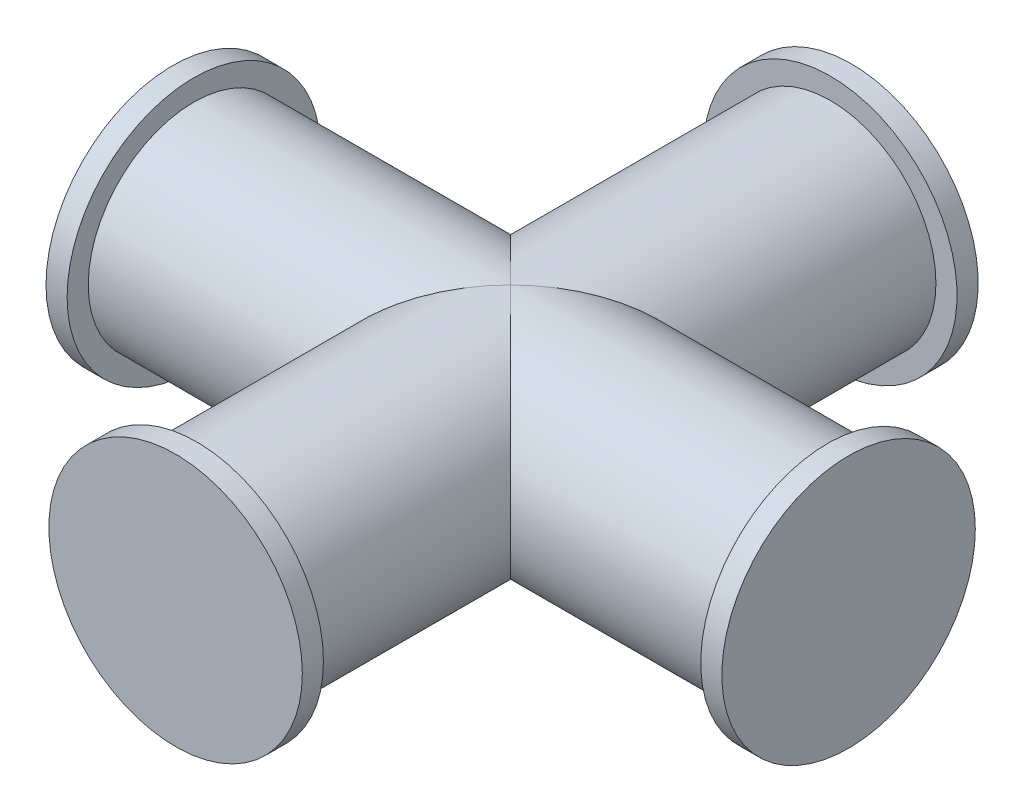
ISO-10303-21;
HEADER;
FILE_DESCRIPTION(('STEP AP214'),'2;1');
FILE_NAME('part.step','',(''),(''),'','','');
FILE_SCHEMA(('AUTOMOTIVE_DESIGN { 1 0 10303 214 1 1 1 1 }'));
ENDSEC;
DATA;
#1=APPLICATION_CONTEXT('core data for automotive mechanical design processes');
#2=APPLICATION_PROTOCOL_DEFINITION('international standard','automotive_design',2000,#1);
#3=PRODUCT_CONTEXT('',#1,'mechanical');
#4=PRODUCT('Part','Part','',(#3));
#5=PRODUCT_RELATED_PRODUCT_CATEGORY('part','',(#4));
#6=PRODUCT_DEFINITION_FORMATION('','',#4);
#7=PRODUCT_DEFINITION_CONTEXT('part definition',#1,'design');
#8=PRODUCT_DEFINITION('design','',#6,#7);
#9=PRODUCT_DEFINITION_SHAPE('','',#8);
#10=(LENGTH_UNIT() NAMED_UNIT(*) SI_UNIT(.MILLI.,.METRE.));
#11=(NAMED_UNIT(*) PLANE_ANGLE_UNIT() SI_UNIT($,.RADIAN.));
#12=(NAMED_UNIT(*) SI_UNIT($,.STERADIAN.) SOLID_ANGLE_UNIT());
#13=UNCERTAINTY_MEASURE_WITH_UNIT(LENGTH_MEASURE(1.E-05),#10,'distance_accuracy_value','');
#14=(GEOMETRIC_REPRESENTATION_CONTEXT(3) GLOBAL_UNCERTAINTY_ASSIGNED_CONTEXT((#13)) GLOBAL_UNIT_ASSIGNED_CONTEXT((#10,
#11,#12)) REPRESENTATION_CONTEXT('',''));
#15=CARTESIAN_POINT('',(0.,0.,0.));
#16=DIRECTION('',(0.,0.,1.));
#17=DIRECTION('',(1.,0.,0.));
#18=AXIS2_PLACEMENT_3D('',#15,#16,#17);
#19=CARTESIAN_POINT('',(0.,0.,60.));
#20=DIRECTION('',(0.,0.,-1.));
#21=DIRECTION('',(-1.,0.,0.));
#22=AXIS2_PLACEMENT_3D('',#19,#20,#21);
#23=CYLINDRICAL_SURFACE('',#22,10.);
#24=CARTESIAN_POINT('',(0.,0.,60.));
#25=DIRECTION('',(0.,0.,1.));
#26=DIRECTION('',(1.,0.,0.));
#27=AXIS2_PLACEMENT_3D('',#24,#25,#26);
#28=CIRCLE('',#27,10.);
#29=CARTESIAN_POINT('',(10.,0.,60.));
#30=VERTEX_POINT('',#29);
#31=EDGE_CURVE('E60',#30,#30,#28,.T.);
#32=ORIENTED_EDGE('',*,*,#31,.F.);
#33=EDGE_LOOP('',(#32));
#34=FACE_BOUND('',#33,.T.);
#35=CARTESIAN_POINT('',(0.,0.,30.27140407));
#36=DIRECTION('',(-0.707106781186547,0.,-0.707106781186547));
#37=DIRECTION('',(0.707106781186547,0.,-0.707106781186547));
#38=AXIS2_PLACEMENT_3D('',#35,#36,#37);
#39=ELLIPSE('',#38,14.1421356237309,10.);
#40=CARTESIAN_POINT('',(0.,-10.,30.27140407));
#41=VERTEX_POINT('',#40);
#42=CARTESIAN_POINT('',(0.,10.,30.27140407));
#43=VERTEX_POINT('',#42);
#44=EDGE_CURVE('E44',#41,#43,#39,.T.);
#45=ORIENTED_EDGE('',*,*,#44,.F.);
#46=CARTESIAN_POINT('',(0.,0.,30.27140407));
#47=DIRECTION('',(0.707106781186547,0.,-0.707106781186547));
#48=DIRECTION('',(-0.707106781186547,0.,-0.707106781186547));
#49=AXIS2_PLACEMENT_3D('',#46,#47,#48);
#50=ELLIPSE('',#49,14.1421356237309,10.);
#51=EDGE_CURVE('E56',#43,#41,#50,.T.);
#52=ORIENTED_EDGE('',*,*,#51,.F.);
#53=EDGE_LOOP('',(#45,#52));
#54=FACE_BOUND('',#53,.T.);
#55=ADVANCED_FACE('F36',(#34,#54),#23,.T.);
#56=CARTESIAN_POINT('',(0.,0.,60.));
#57=DIRECTION('',(0.,0.,1.));
#58=DIRECTION('',(1.,0.,0.));
#59=AXIS2_PLACEMENT_3D('',#56,#57,#58);
#60=PLANE('',#59);
#61=CARTESIAN_POINT('',(0.,0.,60.));
#62=DIRECTION('',(0.,0.,1.));
#63=DIRECTION('',(1.,0.,0.));
#64=AXIS2_PLACEMENT_3D('',#61,#62,#63);
#65=CIRCLE('',#64,12.);
#66=CARTESIAN_POINT('',(12.,0.,60.));
#67=VERTEX_POINT('',#66);
#68=EDGE_CURVE('E99',#67,#67,#65,.T.);
#69=ORIENTED_EDGE('',*,*,#68,.F.);
#70=EDGE_LOOP('',(#69));
#71=FACE_BOUND('',#70,.T.);
#72=ORIENTED_EDGE('',*,*,#31,.T.);
#73=EDGE_LOOP('',(#72));
#74=FACE_BOUND('',#73,.T.);
#75=ADVANCED_FACE('F85',(#71,#74),#60,.F.);
#76=CARTESIAN_POINT('',(0.,0.,62.));
#77=DIRECTION('',(0.,0.,-1.));
#78=DIRECTION('',(-1.,0.,0.));
#79=AXIS2_PLACEMENT_3D('',#76,#77,#78);
#80=CYLINDRICAL_SURFACE('',#79,12.);
#81=CARTESIAN_POINT('',(0.,0.,62.));
#82=DIRECTION('',(0.,0.,1.));
#83=DIRECTION('',(1.,0.,0.));
#84=AXIS2_PLACEMENT_3D('',#81,#82,#83);
#85=CIRCLE('',#84,12.);
#86=CARTESIAN_POINT('',(12.,0.,62.));
#87=VERTEX_POINT('',#86);
#88=EDGE_CURVE('E96',#87,#87,#85,.T.);
#89=ORIENTED_EDGE('',*,*,#88,.F.);
#90=EDGE_LOOP('',(#89));
#91=FACE_BOUND('',#90,.T.);
#92=ORIENTED_EDGE('',*,*,#68,.T.);
#93=EDGE_LOOP('',(#92));
#94=FACE_BOUND('',#93,.T.);
#95=ADVANCED_FACE('F90',(#91,#94),#80,.T.);
#96=CARTESIAN_POINT('',(0.,0.,62.));
#97=DIRECTION('',(0.,0.,1.));
#98=DIRECTION('',(1.,0.,0.));
#99=AXIS2_PLACEMENT_3D('',#96,#97,#98);
#100=PLANE('',#99);
#101=ORIENTED_EDGE('',*,*,#88,.T.);
#102=EDGE_LOOP('',(#101));
#103=FACE_BOUND('',#102,.T.);
#104=ADVANCED_FACE('F82',(#103),#100,.T.);
#105=CARTESIAN_POINT('',(30.,0.,30.27140407));
#106=DIRECTION('',(-1.,0.,0.));
#107=DIRECTION('',(0.,0.,1.));
#108=AXIS2_PLACEMENT_3D('',#105,#106,#107);
#109=CYLINDRICAL_SURFACE('',#108,10.);
#110=CARTESIAN_POINT('',(-30.,0.,30.27140407));
#111=DIRECTION('',(-1.,0.,0.));
#112=DIRECTION('',(0.,0.,1.));
#113=AXIS2_PLACEMENT_3D('',#110,#111,#112);
#114=CIRCLE('',#113,10.);
#115=CARTESIAN_POINT('',(-30.,0.,40.27140407));
#116=VERTEX_POINT('',#115);
#117=EDGE_CURVE('E120',#116,#116,#114,.T.);
#118=ORIENTED_EDGE('',*,*,#117,.F.);
#119=EDGE_LOOP('',(#118));
#120=FACE_BOUND('',#119,.T.);
#121=CARTESIAN_POINT('',(0.,0.,30.27140407));
#122=DIRECTION('',(0.707106781186547,0.,-0.707106781186547));
#123=DIRECTION('',(-0.707106781186547,0.,-0.707106781186547));
#124=AXIS2_PLACEMENT_3D('',#121,#122,#123);
#125=ELLIPSE('',#124,14.1421356237309,10.);
#126=EDGE_CURVE('E50',#43,#41,#125,.F.);
#127=ORIENTED_EDGE('',*,*,#126,.T.);
#128=ORIENTED_EDGE('',*,*,#44,.T.);
#129=EDGE_LOOP('',(#127,#128));
#130=FACE_BOUND('',#129,.T.);
#131=ADVANCED_FACE('F62',(#120,#130),#109,.T.);
#132=CARTESIAN_POINT('',(0.,0.,-2.));
#133=DIRECTION('',(0.,0.,-1.));
#134=DIRECTION('',(-1.,0.,0.));
#135=AXIS2_PLACEMENT_3D('',#132,#133,#134);
#136=PLANE('',#135);
#137=CARTESIAN_POINT('',(0.,0.,-2.));
#138=DIRECTION('',(0.,0.,-1.));
#139=DIRECTION('',(-1.,0.,0.));
#140=AXIS2_PLACEMENT_3D('',#137,#138,#139);
#141=CIRCLE('',#140,12.);
#142=CARTESIAN_POINT('',(-12.,0.,-2.));
#143=VERTEX_POINT('',#142);
#144=EDGE_CURVE('E107',#143,#143,#141,.T.);
#145=ORIENTED_EDGE('',*,*,#144,.T.);
#146=EDGE_LOOP('',(#145));
#147=FACE_BOUND('',#146,.T.);
#148=ADVANCED_FACE('F81',(#147),#136,.T.);
#149=CARTESIAN_POINT('',(0.,0.,-2.));
#150=DIRECTION('',(0.,0.,1.));
#151=DIRECTION('',(1.,0.,0.));
#152=AXIS2_PLACEMENT_3D('',#149,#150,#151);
#153=CYLINDRICAL_SURFACE('',#152,12.);
#154=ORIENTED_EDGE('',*,*,#144,.F.);
#155=EDGE_LOOP('',(#154));
#156=FACE_BOUND('',#155,.T.);
#157=CARTESIAN_POINT('',(0.,0.,0.));
#158=DIRECTION('',(0.,0.,-1.));
#159=DIRECTION('',(-1.,0.,0.));
#160=AXIS2_PLACEMENT_3D('',#157,#158,#159);
#161=CIRCLE('',#160,12.);
#162=CARTESIAN_POINT('',(-12.,0.,0.));
#163=VERTEX_POINT('',#162);
#164=EDGE_CURVE('E108',#163,#163,#161,.T.);
#165=ORIENTED_EDGE('',*,*,#164,.T.);
#166=EDGE_LOOP('',(#165));
#167=FACE_BOUND('',#166,.T.);
#168=ADVANCED_FACE('F217',(#156,#167),#153,.T.);
#169=CARTESIAN_POINT('',(0.,0.,0.));
#170=DIRECTION('',(0.,0.,-1.));
#171=DIRECTION('',(-1.,0.,0.));
#172=AXIS2_PLACEMENT_3D('',#169,#170,#171);
#173=PLANE('',#172);
#174=ORIENTED_EDGE('',*,*,#164,.F.);
#175=EDGE_LOOP('',(#174));
#176=FACE_BOUND('',#175,.T.);
#177=CARTESIAN_POINT('',(0.,0.,0.));
#178=DIRECTION('',(0.,0.,-1.));
#179=DIRECTION('',(-1.,0.,0.));
#180=AXIS2_PLACEMENT_3D('',#177,#178,#179);
#181=CIRCLE('',#180,10.);
#182=CARTESIAN_POINT('',(-10.,0.,0.));
#183=VERTEX_POINT('',#182);
#184=EDGE_CURVE('E103',#183,#183,#181,.T.);
#185=ORIENTED_EDGE('',*,*,#184,.T.);
#186=EDGE_LOOP('',(#185));
#187=FACE_BOUND('',#186,.T.);
#188=ADVANCED_FACE('F75',(#176,#187),#173,.F.);
#189=ORIENTED_EDGE('',*,*,#184,.F.);
#190=EDGE_LOOP('',(#189));
#191=FACE_BOUND('',#190,.T.);
#192=CARTESIAN_POINT('',(0.,0.,30.27140407));
#193=DIRECTION('',(-0.707106781186547,0.,-0.707106781186547));
#194=DIRECTION('',(0.707106781186547,0.,-0.707106781186547));
#195=AXIS2_PLACEMENT_3D('',#192,#193,#194);
#196=ELLIPSE('',#195,14.1421356237309,10.);
#197=EDGE_CURVE('E11',#41,#43,#196,.F.);
#198=ORIENTED_EDGE('',*,*,#197,.F.);
#199=ORIENTED_EDGE('',*,*,#126,.F.);
#200=EDGE_LOOP('',(#198,#199));
#201=FACE_BOUND('',#200,.T.);
#202=ADVANCED_FACE('F38',(#191,#201),#23,.T.);
#203=CARTESIAN_POINT('',(30.,0.,30.27140407));
#204=DIRECTION('',(1.,0.,0.));
#205=DIRECTION('',(0.,0.,-1.));
#206=AXIS2_PLACEMENT_3D('',#203,#204,#205);
#207=CIRCLE('',#206,10.);
#208=CARTESIAN_POINT('',(30.,0.,20.27140407));
#209=VERTEX_POINT('',#208);
#210=EDGE_CURVE('E111',#209,#209,#207,.T.);
#211=ORIENTED_EDGE('',*,*,#210,.F.);
#212=EDGE_LOOP('',(#211));
#213=FACE_BOUND('',#212,.T.);
#214=ORIENTED_EDGE('',*,*,#51,.T.);
#215=ORIENTED_EDGE('',*,*,#197,.T.);
#216=EDGE_LOOP('',(#214,#215));
#217=FACE_BOUND('',#216,.T.);
#218=ADVANCED_FACE('F63',(#213,#217),#109,.T.);
#219=CARTESIAN_POINT('',(30.,0.,30.27140407));
#220=DIRECTION('',(1.,0.,0.));
#221=DIRECTION('',(0.,0.,-1.));
#222=AXIS2_PLACEMENT_3D('',#219,#220,#221);
#223=PLANE('',#222);
#224=CARTESIAN_POINT('',(30.,0.,30.27140407));
#225=DIRECTION('',(1.,0.,0.));
#226=DIRECTION('',(0.,0.,-1.));
#227=AXIS2_PLACEMENT_3D('',#224,#225,#226);
#228=CIRCLE('',#227,12.);
#229=CARTESIAN_POINT('',(30.,0.,18.27140407));
#230=VERTEX_POINT('',#229);
#231=EDGE_CURVE('E117',#230,#230,#228,.T.);
#232=ORIENTED_EDGE('',*,*,#231,.F.);
#233=EDGE_LOOP('',(#232));
#234=FACE_BOUND('',#233,.T.);
#235=ORIENTED_EDGE('',*,*,#210,.T.);
#236=EDGE_LOOP('',(#235));
#237=FACE_BOUND('',#236,.T.);
#238=ADVANCED_FACE('F65',(#234,#237),#223,.F.);
#239=CARTESIAN_POINT('',(32.,0.,30.27140407));
#240=DIRECTION('',(-1.,0.,0.));
#241=DIRECTION('',(0.,0.,1.));
#242=AXIS2_PLACEMENT_3D('',#239,#240,#241);
#243=CYLINDRICAL_SURFACE('',#242,12.);
#244=CARTESIAN_POINT('',(32.,0.,30.27140407));
#245=DIRECTION('',(1.,0.,0.));
#246=DIRECTION('',(0.,0.,-1.));
#247=AXIS2_PLACEMENT_3D('',#244,#245,#246);
#248=CIRCLE('',#247,12.);
#249=CARTESIAN_POINT('',(32.,0.,18.27140407));
#250=VERTEX_POINT('',#249);
#251=EDGE_CURVE('E116',#250,#250,#248,.T.);
#252=ORIENTED_EDGE('',*,*,#251,.F.);
#253=EDGE_LOOP('',(#252));
#254=FACE_BOUND('',#253,.T.);
#255=ORIENTED_EDGE('',*,*,#231,.T.);
#256=EDGE_LOOP('',(#255));
#257=FACE_BOUND('',#256,.T.);
#258=ADVANCED_FACE('F72',(#254,#257),#243,.T.);
#259=CARTESIAN_POINT('',(32.,0.,30.27140407));
#260=DIRECTION('',(1.,0.,0.));
#261=DIRECTION('',(0.,0.,-1.));
#262=AXIS2_PLACEMENT_3D('',#259,#260,#261);
#263=PLANE('',#262);
#264=ORIENTED_EDGE('',*,*,#251,.T.);
#265=EDGE_LOOP('',(#264));
#266=FACE_BOUND('',#265,.T.);
#267=ADVANCED_FACE('F143',(#266),#263,.T.);
#268=CARTESIAN_POINT('',(-30.,0.,30.27140407));
#269=DIRECTION('',(-1.,0.,0.));
#270=DIRECTION('',(0.,0.,1.));
#271=AXIS2_PLACEMENT_3D('',#268,#269,#270);
#272=PLANE('',#271);
#273=CARTESIAN_POINT('',(-30.,0.,30.27140407));
#274=DIRECTION('',(-1.,0.,0.));
#275=DIRECTION('',(0.,0.,1.));
#276=AXIS2_PLACEMENT_3D('',#273,#274,#275);
#277=CIRCLE('',#276,12.);
#278=CARTESIAN_POINT('',(-30.,0.,42.27140407));
#279=VERTEX_POINT('',#278);
#280=EDGE_CURVE('E126',#279,#279,#277,.T.);
#281=ORIENTED_EDGE('',*,*,#280,.F.);
#282=EDGE_LOOP('',(#281));
#283=FACE_BOUND('',#282,.T.);
#284=ORIENTED_EDGE('',*,*,#117,.T.);
#285=EDGE_LOOP('',(#284));
#286=FACE_BOUND('',#285,.T.);
#287=ADVANCED_FACE('F137',(#283,#286),#272,.F.);
#288=CARTESIAN_POINT('',(-32.,0.,30.27140407));
#289=DIRECTION('',(1.,0.,0.));
#290=DIRECTION('',(0.,0.,-1.));
#291=AXIS2_PLACEMENT_3D('',#288,#289,#290);
#292=CYLINDRICAL_SURFACE('',#291,12.);
#293=CARTESIAN_POINT('',(-32.,0.,30.27140407));
#294=DIRECTION('',(-1.,0.,0.));
#295=DIRECTION('',(0.,0.,1.));
#296=AXIS2_PLACEMENT_3D('',#293,#294,#295);
#297=CIRCLE('',#296,12.);
#298=CARTESIAN_POINT('',(-32.,0.,42.27140407));
#299=VERTEX_POINT('',#298);
#300=EDGE_CURVE('E125',#299,#299,#297,.T.);
#301=ORIENTED_EDGE('',*,*,#300,.F.);
#302=EDGE_LOOP('',(#301));
#303=FACE_BOUND('',#302,.T.);
#304=ORIENTED_EDGE('',*,*,#280,.T.);
#305=EDGE_LOOP('',(#304));
#306=FACE_BOUND('',#305,.T.);
#307=ADVANCED_FACE('F134',(#303,#306),#292,.T.);
#308=CARTESIAN_POINT('',(-32.,0.,30.27140407));
#309=DIRECTION('',(-1.,0.,0.));
#310=DIRECTION('',(0.,0.,1.));
#311=AXIS2_PLACEMENT_3D('',#308,#309,#310);
#312=PLANE('',#311);
#313=ORIENTED_EDGE('',*,*,#300,.T.);
#314=EDGE_LOOP('',(#313));
#315=FACE_BOUND('',#314,.T.);
#316=ADVANCED_FACE('F132',(#315),#312,.T.);
#317=CLOSED_SHELL('',(#55,#75,#95,#104,#131,#148,#168,#188,#202,#218,#238,#258,#267,#287,#307,#316));
#318=MANIFOLD_SOLID_BREP('B2',#317);
#319=ADVANCED_BREP_SHAPE_REPRESENTATION('',(#18,#318),#14);
#320=SHAPE_DEFINITION_REPRESENTATION(#9,#319);
ENDSEC;
END-ISO-10303-21;
